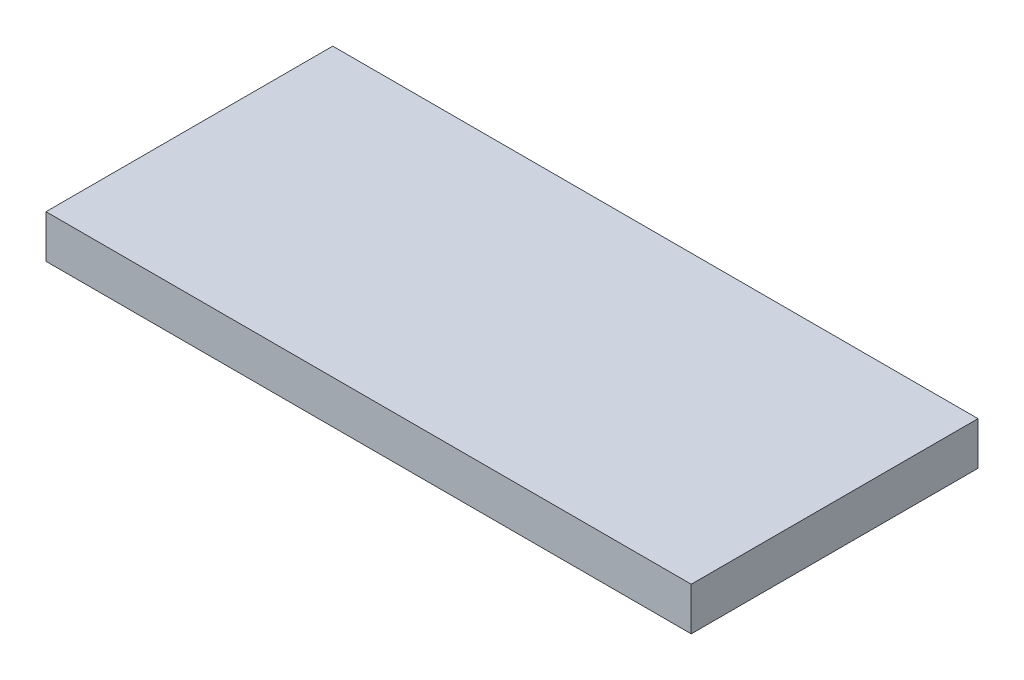
ISO-10303-21;
HEADER;
FILE_DESCRIPTION(('STEP AP214'),'2;1');
FILE_NAME('part.step','',(''),(''),'','','');
FILE_SCHEMA(('AUTOMOTIVE_DESIGN { 1 0 10303 214 1 1 1 1 }'));
ENDSEC;
DATA;
#1=APPLICATION_CONTEXT('core data for automotive mechanical design processes');
#2=APPLICATION_PROTOCOL_DEFINITION('international standard','automotive_design',2000,#1);
#3=PRODUCT_CONTEXT('',#1,'mechanical');
#4=PRODUCT('Part','Part','',(#3));
#5=PRODUCT_RELATED_PRODUCT_CATEGORY('part','',(#4));
#6=PRODUCT_DEFINITION_FORMATION('','',#4);
#7=PRODUCT_DEFINITION_CONTEXT('part definition',#1,'design');
#8=PRODUCT_DEFINITION('design','',#6,#7);
#9=PRODUCT_DEFINITION_SHAPE('','',#8);
#10=(LENGTH_UNIT() NAMED_UNIT(*) SI_UNIT(.MILLI.,.METRE.));
#11=(NAMED_UNIT(*) PLANE_ANGLE_UNIT() SI_UNIT($,.RADIAN.));
#12=(NAMED_UNIT(*) SI_UNIT($,.STERADIAN.) SOLID_ANGLE_UNIT());
#13=UNCERTAINTY_MEASURE_WITH_UNIT(LENGTH_MEASURE(1.E-05),#10,'distance_accuracy_value','');
#14=(GEOMETRIC_REPRESENTATION_CONTEXT(3) GLOBAL_UNCERTAINTY_ASSIGNED_CONTEXT((#13)) GLOBAL_UNIT_ASSIGNED_CONTEXT((#10,
#11,#12)) REPRESENTATION_CONTEXT('',''));
#15=CARTESIAN_POINT('',(0.,0.,0.));
#16=DIRECTION('',(0.,0.,1.));
#17=DIRECTION('',(1.,0.,0.));
#18=AXIS2_PLACEMENT_3D('',#15,#16,#17);
#19=CARTESIAN_POINT('',(22.5,3.,10.));
#20=DIRECTION('',(-1.,0.,0.));
#21=DIRECTION('',(0.,0.,1.));
#22=AXIS2_PLACEMENT_3D('',#19,#20,#21);
#23=PLANE('',#22);
#24=DIRECTION('',(0.,0.,-1.));
#25=VECTOR('',#24,1.);
#26=CARTESIAN_POINT('',(22.5,0.,10.));
#27=LINE('',#26,#25);
#28=CARTESIAN_POINT('',(22.5,0.,10.));
#29=VERTEX_POINT('',#28);
#30=CARTESIAN_POINT('',(22.5,0.,-10.));
#31=VERTEX_POINT('',#30);
#32=EDGE_CURVE('E162',#29,#31,#27,.T.);
#33=ORIENTED_EDGE('',*,*,#32,.T.);
#34=DIRECTION('',(0.,-1.,0.));
#35=VECTOR('',#34,1.);
#36=CARTESIAN_POINT('',(22.5,3.,-10.));
#37=LINE('',#36,#35);
#38=CARTESIAN_POINT('',(22.5,3.,-10.));
#39=VERTEX_POINT('',#38);
#40=EDGE_CURVE('E11',#39,#31,#37,.T.);
#41=ORIENTED_EDGE('',*,*,#40,.F.);
#42=DIRECTION('',(0.,0.,-1.));
#43=VECTOR('',#42,1.);
#44=CARTESIAN_POINT('',(22.5,3.,10.));
#45=LINE('',#44,#43);
#46=CARTESIAN_POINT('',(22.5,3.,10.));
#47=VERTEX_POINT('',#46);
#48=EDGE_CURVE('E168',#47,#39,#45,.T.);
#49=ORIENTED_EDGE('',*,*,#48,.F.);
#50=DIRECTION('',(0.,-1.,0.));
#51=VECTOR('',#50,1.);
#52=CARTESIAN_POINT('',(22.5,3.,10.));
#53=LINE('',#52,#51);
#54=EDGE_CURVE('E178',#47,#29,#53,.T.);
#55=ORIENTED_EDGE('',*,*,#54,.T.);
#56=EDGE_LOOP('',(#33,#41,#49,#55));
#57=FACE_BOUND('',#56,.T.);
#58=ADVANCED_FACE('F43',(#57),#23,.F.);
#59=CARTESIAN_POINT('',(-22.5,3.,-10.));
#60=DIRECTION('',(0.,0.,1.));
#61=DIRECTION('',(1.,0.,0.));
#62=AXIS2_PLACEMENT_3D('',#59,#60,#61);
#63=PLANE('',#62);
#64=DIRECTION('',(-1.,0.,0.));
#65=VECTOR('',#64,1.);
#66=CARTESIAN_POINT('',(-22.5,0.,-10.));
#67=LINE('',#66,#65);
#68=CARTESIAN_POINT('',(-22.5,0.,-10.));
#69=VERTEX_POINT('',#68);
#70=EDGE_CURVE('E182',#31,#69,#67,.T.);
#71=ORIENTED_EDGE('',*,*,#70,.T.);
#72=DIRECTION('',(0.,-1.,0.));
#73=VECTOR('',#72,1.);
#74=CARTESIAN_POINT('',(-22.5,3.,-10.));
#75=LINE('',#74,#73);
#76=CARTESIAN_POINT('',(-22.5,3.,-10.));
#77=VERTEX_POINT('',#76);
#78=EDGE_CURVE('E51',#77,#69,#75,.T.);
#79=ORIENTED_EDGE('',*,*,#78,.F.);
#80=DIRECTION('',(-1.,0.,0.));
#81=VECTOR('',#80,1.);
#82=CARTESIAN_POINT('',(-22.5,3.,-10.));
#83=LINE('',#82,#81);
#84=EDGE_CURVE('E95',#39,#77,#83,.T.);
#85=ORIENTED_EDGE('',*,*,#84,.F.);
#86=ORIENTED_EDGE('',*,*,#40,.T.);
#87=EDGE_LOOP('',(#71,#79,#85,#86));
#88=FACE_BOUND('',#87,.T.);
#89=ADVANCED_FACE('F216',(#88),#63,.F.);
#90=CARTESIAN_POINT('',(-22.5,3.,10.));
#91=DIRECTION('',(1.,0.,0.));
#92=DIRECTION('',(0.,0.,-1.));
#93=AXIS2_PLACEMENT_3D('',#90,#91,#92);
#94=PLANE('',#93);
#95=DIRECTION('',(0.,0.,1.));
#96=VECTOR('',#95,1.);
#97=CARTESIAN_POINT('',(-22.5,0.,10.));
#98=LINE('',#97,#96);
#99=CARTESIAN_POINT('',(-22.5,0.,10.));
#100=VERTEX_POINT('',#99);
#101=EDGE_CURVE('E185',#69,#100,#98,.T.);
#102=ORIENTED_EDGE('',*,*,#101,.T.);
#103=DIRECTION('',(0.,-1.,0.));
#104=VECTOR('',#103,1.);
#105=CARTESIAN_POINT('',(-22.5,3.,10.));
#106=LINE('',#105,#104);
#107=CARTESIAN_POINT('',(-22.5,3.,10.));
#108=VERTEX_POINT('',#107);
#109=EDGE_CURVE('E192',#108,#100,#106,.T.);
#110=ORIENTED_EDGE('',*,*,#109,.F.);
#111=DIRECTION('',(0.,0.,1.));
#112=VECTOR('',#111,1.);
#113=CARTESIAN_POINT('',(-22.5,3.,10.));
#114=LINE('',#113,#112);
#115=EDGE_CURVE('E173',#77,#108,#114,.T.);
#116=ORIENTED_EDGE('',*,*,#115,.F.);
#117=ORIENTED_EDGE('',*,*,#78,.T.);
#118=EDGE_LOOP('',(#102,#110,#116,#117));
#119=FACE_BOUND('',#118,.T.);
#120=ADVANCED_FACE('F199',(#119),#94,.F.);
#121=CARTESIAN_POINT('',(-22.5,3.,10.));
#122=DIRECTION('',(0.,0.,-1.));
#123=DIRECTION('',(-1.,0.,0.));
#124=AXIS2_PLACEMENT_3D('',#121,#122,#123);
#125=PLANE('',#124);
#126=DIRECTION('',(1.,0.,0.));
#127=VECTOR('',#126,1.);
#128=CARTESIAN_POINT('',(-22.5,0.,10.));
#129=LINE('',#128,#127);
#130=EDGE_CURVE('E88',#100,#29,#129,.T.);
#131=ORIENTED_EDGE('',*,*,#130,.T.);
#132=ORIENTED_EDGE('',*,*,#54,.F.);
#133=DIRECTION('',(1.,0.,0.));
#134=VECTOR('',#133,1.);
#135=CARTESIAN_POINT('',(-22.5,3.,10.));
#136=LINE('',#135,#134);
#137=EDGE_CURVE('E67',#108,#47,#136,.T.);
#138=ORIENTED_EDGE('',*,*,#137,.F.);
#139=ORIENTED_EDGE('',*,*,#109,.T.);
#140=EDGE_LOOP('',(#131,#132,#138,#139));
#141=FACE_BOUND('',#140,.T.);
#142=ADVANCED_FACE('F207',(#141),#125,.F.);
#143=CARTESIAN_POINT('',(0.,3.,0.));
#144=DIRECTION('',(0.,-1.,0.));
#145=DIRECTION('',(0.,0.,-1.));
#146=AXIS2_PLACEMENT_3D('',#143,#144,#145);
#147=PLANE('',#146);
#148=ORIENTED_EDGE('',*,*,#48,.T.);
#149=ORIENTED_EDGE('',*,*,#84,.T.);
#150=ORIENTED_EDGE('',*,*,#115,.T.);
#151=ORIENTED_EDGE('',*,*,#137,.T.);
#152=EDGE_LOOP('',(#148,#149,#150,#151));
#153=FACE_BOUND('',#152,.T.);
#154=ADVANCED_FACE('F209',(#153),#147,.F.);
#155=CARTESIAN_POINT('',(0.,0.,0.));
#156=DIRECTION('',(0.,-1.,0.));
#157=DIRECTION('',(0.,0.,-1.));
#158=AXIS2_PLACEMENT_3D('',#155,#156,#157);
#159=PLANE('',#158);
#160=DIRECTION('',(0.,0.,1.));
#161=VECTOR('',#160,1.);
#162=CARTESIAN_POINT('',(19.5,0.,-4.7));
#163=LINE('',#162,#161);
#164=CARTESIAN_POINT('',(19.5,0.,-4.7));
#165=VERTEX_POINT('',#164);
#166=CARTESIAN_POINT('',(19.5,0.,4.7));
#167=VERTEX_POINT('',#166);
#168=EDGE_CURVE('E58',#165,#167,#163,.T.);
#169=ORIENTED_EDGE('',*,*,#168,.F.);
#170=DIRECTION('',(1.,0.,0.));
#171=VECTOR('',#170,1.);
#172=CARTESIAN_POINT('',(-19.5,0.,-4.7));
#173=LINE('',#172,#171);
#174=CARTESIAN_POINT('',(-19.5,0.,-4.7));
#175=VERTEX_POINT('',#174);
#176=EDGE_CURVE('E140',#175,#165,#173,.T.);
#177=ORIENTED_EDGE('',*,*,#176,.F.);
#178=DIRECTION('',(0.,0.,-1.));
#179=VECTOR('',#178,1.);
#180=CARTESIAN_POINT('',(-19.5,0.,-4.7));
#181=LINE('',#180,#179);
#182=CARTESIAN_POINT('',(-19.5,0.,4.7));
#183=VERTEX_POINT('',#182);
#184=EDGE_CURVE('E144',#183,#175,#181,.T.);
#185=ORIENTED_EDGE('',*,*,#184,.F.);
#186=DIRECTION('',(-1.,0.,0.));
#187=VECTOR('',#186,1.);
#188=CARTESIAN_POINT('',(-19.5,0.,4.7));
#189=LINE('',#188,#187);
#190=EDGE_CURVE('E153',#167,#183,#189,.T.);
#191=ORIENTED_EDGE('',*,*,#190,.F.);
#192=EDGE_LOOP('',(#169,#177,#185,#191));
#193=FACE_BOUND('',#192,.T.);
#194=ORIENTED_EDGE('',*,*,#32,.F.);
#195=ORIENTED_EDGE('',*,*,#130,.F.);
#196=ORIENTED_EDGE('',*,*,#101,.F.);
#197=ORIENTED_EDGE('',*,*,#70,.F.);
#198=EDGE_LOOP('',(#194,#195,#196,#197));
#199=FACE_BOUND('',#198,.T.);
#200=ADVANCED_FACE('F203',(#193,#199),#159,.T.);
#201=CARTESIAN_POINT('',(19.5,1.5,-4.7));
#202=DIRECTION('',(1.,0.,0.));
#203=DIRECTION('',(0.,0.,-1.));
#204=AXIS2_PLACEMENT_3D('',#201,#202,#203);
#205=PLANE('',#204);
#206=ORIENTED_EDGE('',*,*,#168,.T.);
#207=DIRECTION('',(0.,-1.,0.));
#208=VECTOR('',#207,1.);
#209=CARTESIAN_POINT('',(19.5,1.5,4.7));
#210=LINE('',#209,#208);
#211=CARTESIAN_POINT('',(19.5,1.5,4.7));
#212=VERTEX_POINT('',#211);
#213=EDGE_CURVE('E115',#212,#167,#210,.T.);
#214=ORIENTED_EDGE('',*,*,#213,.F.);
#215=DIRECTION('',(0.,0.,1.));
#216=VECTOR('',#215,1.);
#217=CARTESIAN_POINT('',(19.5,1.5,-4.7));
#218=LINE('',#217,#216);
#219=CARTESIAN_POINT('',(19.5,1.5,-4.7));
#220=VERTEX_POINT('',#219);
#221=EDGE_CURVE('E119',#220,#212,#218,.T.);
#222=ORIENTED_EDGE('',*,*,#221,.F.);
#223=DIRECTION('',(0.,-1.,0.));
#224=VECTOR('',#223,1.);
#225=CARTESIAN_POINT('',(19.5,1.5,-4.7));
#226=LINE('',#225,#224);
#227=EDGE_CURVE('E159',#220,#165,#226,.T.);
#228=ORIENTED_EDGE('',*,*,#227,.T.);
#229=EDGE_LOOP('',(#206,#214,#222,#228));
#230=FACE_BOUND('',#229,.T.);
#231=ADVANCED_FACE('F117',(#230),#205,.F.);
#232=CARTESIAN_POINT('',(-19.5,1.5,-4.7));
#233=DIRECTION('',(0.,0.,-1.));
#234=DIRECTION('',(-1.,0.,0.));
#235=AXIS2_PLACEMENT_3D('',#232,#233,#234);
#236=PLANE('',#235);
#237=ORIENTED_EDGE('',*,*,#176,.T.);
#238=ORIENTED_EDGE('',*,*,#227,.F.);
#239=DIRECTION('',(1.,0.,0.));
#240=VECTOR('',#239,1.);
#241=CARTESIAN_POINT('',(-19.5,1.5,-4.7));
#242=LINE('',#241,#240);
#243=CARTESIAN_POINT('',(-19.5,1.5,-4.7));
#244=VERTEX_POINT('',#243);
#245=EDGE_CURVE('E126',#244,#220,#242,.T.);
#246=ORIENTED_EDGE('',*,*,#245,.F.);
#247=DIRECTION('',(0.,-1.,0.));
#248=VECTOR('',#247,1.);
#249=CARTESIAN_POINT('',(-19.5,1.5,-4.7));
#250=LINE('',#249,#248);
#251=EDGE_CURVE('E163',#244,#175,#250,.T.);
#252=ORIENTED_EDGE('',*,*,#251,.T.);
#253=EDGE_LOOP('',(#237,#238,#246,#252));
#254=FACE_BOUND('',#253,.T.);
#255=ADVANCED_FACE('F260',(#254),#236,.F.);
#256=CARTESIAN_POINT('',(-19.5,1.5,-4.7));
#257=DIRECTION('',(-1.,0.,0.));
#258=DIRECTION('',(0.,0.,1.));
#259=AXIS2_PLACEMENT_3D('',#256,#257,#258);
#260=PLANE('',#259);
#261=ORIENTED_EDGE('',*,*,#184,.T.);
#262=ORIENTED_EDGE('',*,*,#251,.F.);
#263=DIRECTION('',(0.,0.,-1.));
#264=VECTOR('',#263,1.);
#265=CARTESIAN_POINT('',(-19.5,1.5,-4.7));
#266=LINE('',#265,#264);
#267=CARTESIAN_POINT('',(-19.5,1.5,4.7));
#268=VERTEX_POINT('',#267);
#269=EDGE_CURVE('E135',#268,#244,#266,.T.);
#270=ORIENTED_EDGE('',*,*,#269,.F.);
#271=DIRECTION('',(0.,-1.,0.));
#272=VECTOR('',#271,1.);
#273=CARTESIAN_POINT('',(-19.5,1.5,4.7));
#274=LINE('',#273,#272);
#275=EDGE_CURVE('E125',#268,#183,#274,.T.);
#276=ORIENTED_EDGE('',*,*,#275,.T.);
#277=EDGE_LOOP('',(#261,#262,#270,#276));
#278=FACE_BOUND('',#277,.T.);
#279=ADVANCED_FACE('F270',(#278),#260,.F.);
#280=CARTESIAN_POINT('',(-19.5,1.5,4.7));
#281=DIRECTION('',(0.,0.,1.));
#282=DIRECTION('',(1.,0.,0.));
#283=AXIS2_PLACEMENT_3D('',#280,#281,#282);
#284=PLANE('',#283);
#285=ORIENTED_EDGE('',*,*,#190,.T.);
#286=ORIENTED_EDGE('',*,*,#275,.F.);
#287=DIRECTION('',(-1.,0.,0.));
#288=VECTOR('',#287,1.);
#289=CARTESIAN_POINT('',(-19.5,1.5,4.7));
#290=LINE('',#289,#288);
#291=EDGE_CURVE('E129',#212,#268,#290,.T.);
#292=ORIENTED_EDGE('',*,*,#291,.F.);
#293=ORIENTED_EDGE('',*,*,#213,.T.);
#294=EDGE_LOOP('',(#285,#286,#292,#293));
#295=FACE_BOUND('',#294,.T.);
#296=ADVANCED_FACE('F130',(#295),#284,.F.);
#297=CARTESIAN_POINT('',(0.,1.5,0.));
#298=DIRECTION('',(0.,1.,0.));
#299=DIRECTION('',(0.,0.,1.));
#300=AXIS2_PLACEMENT_3D('',#297,#298,#299);
#301=PLANE('',#300);
#302=ORIENTED_EDGE('',*,*,#221,.T.);
#303=ORIENTED_EDGE('',*,*,#291,.T.);
#304=ORIENTED_EDGE('',*,*,#269,.T.);
#305=ORIENTED_EDGE('',*,*,#245,.T.);
#306=EDGE_LOOP('',(#302,#303,#304,#305));
#307=FACE_BOUND('',#306,.T.);
#308=ADVANCED_FACE('F137',(#307),#301,.F.);
#309=CLOSED_SHELL('',(#58,#89,#120,#142,#154,#200,#231,#255,#279,#296,#308));
#310=MANIFOLD_SOLID_BREP('B2',#309);
#311=ADVANCED_BREP_SHAPE_REPRESENTATION('',(#18,#310),#14);
#312=SHAPE_DEFINITION_REPRESENTATION(#9,#311);
ENDSEC;
END-ISO-10303-21;
